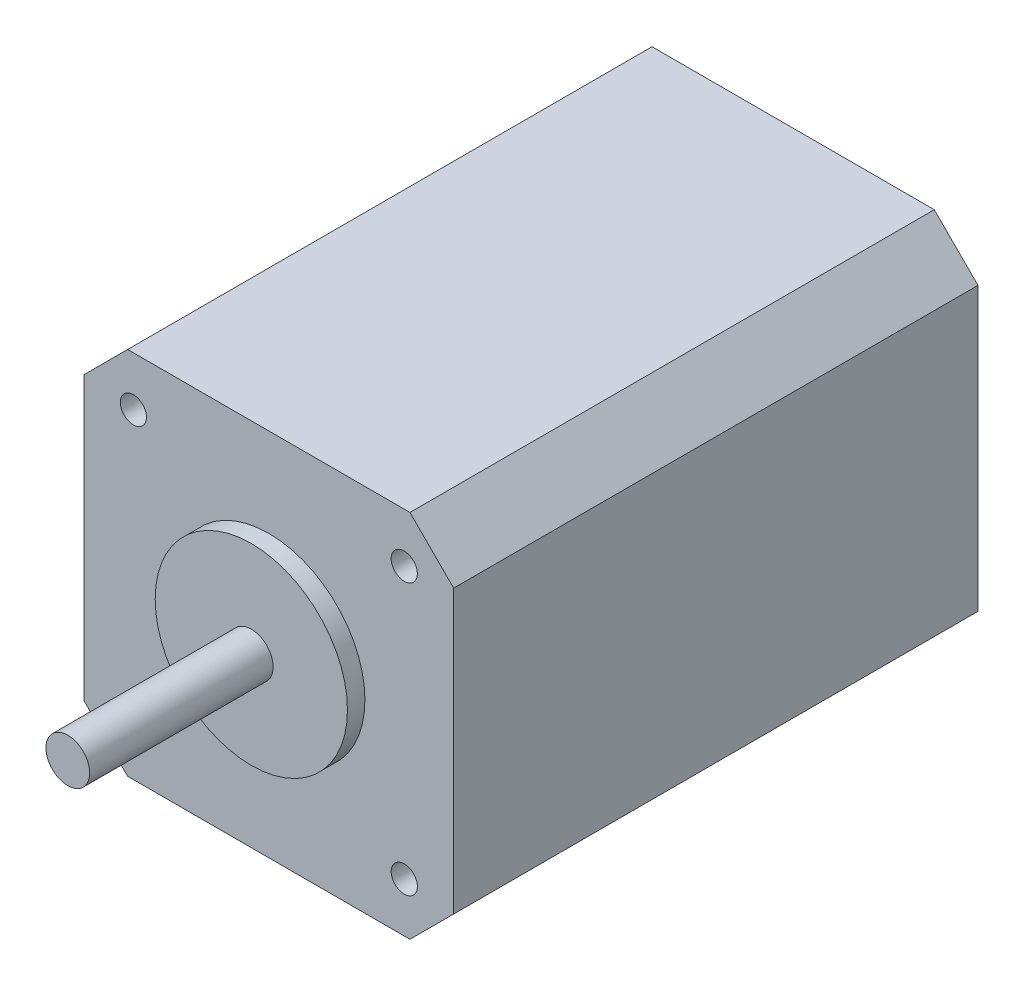
ISO-10303-21;
HEADER;
FILE_DESCRIPTION(('STEP AP214'),'2;1');
FILE_NAME('part.step','',(''),(''),'','','');
FILE_SCHEMA(('AUTOMOTIVE_DESIGN { 1 0 10303 214 1 1 1 1 }'));
ENDSEC;
DATA;
#1=APPLICATION_CONTEXT('core data for automotive mechanical design processes');
#2=APPLICATION_PROTOCOL_DEFINITION('international standard','automotive_design',2000,#1);
#3=PRODUCT_CONTEXT('',#1,'mechanical');
#4=PRODUCT('Part','Part','',(#3));
#5=PRODUCT_RELATED_PRODUCT_CATEGORY('part','',(#4));
#6=PRODUCT_DEFINITION_FORMATION('','',#4);
#7=PRODUCT_DEFINITION_CONTEXT('part definition',#1,'design');
#8=PRODUCT_DEFINITION('design','',#6,#7);
#9=PRODUCT_DEFINITION_SHAPE('','',#8);
#10=(LENGTH_UNIT() NAMED_UNIT(*) SI_UNIT(.MILLI.,.METRE.));
#11=(NAMED_UNIT(*) PLANE_ANGLE_UNIT() SI_UNIT($,.RADIAN.));
#12=(NAMED_UNIT(*) SI_UNIT($,.STERADIAN.) SOLID_ANGLE_UNIT());
#13=UNCERTAINTY_MEASURE_WITH_UNIT(LENGTH_MEASURE(1.E-05),#10,'distance_accuracy_value','');
#14=(GEOMETRIC_REPRESENTATION_CONTEXT(3) GLOBAL_UNCERTAINTY_ASSIGNED_CONTEXT((#13)) GLOBAL_UNIT_ASSIGNED_CONTEXT((#10,
#11,#12)) REPRESENTATION_CONTEXT('',''));
#15=CARTESIAN_POINT('',(0.,0.,0.));
#16=DIRECTION('',(0.,0.,1.));
#17=DIRECTION('',(1.,0.,0.));
#18=AXIS2_PLACEMENT_3D('',#15,#16,#17);
#19=CARTESIAN_POINT('',(0.,0.,30.));
#20=DIRECTION('',(0.,0.,-1.));
#21=DIRECTION('',(-1.,0.,0.));
#22=AXIS2_PLACEMENT_3D('',#19,#20,#21);
#23=PLANE('',#22);
#24=CARTESIAN_POINT('',(0.,0.,30.));
#25=DIRECTION('',(0.,0.,1.));
#26=DIRECTION('',(1.,0.,0.));
#27=AXIS2_PLACEMENT_3D('',#24,#25,#26);
#28=CIRCLE('',#27,11.);
#29=CARTESIAN_POINT('',(11.,0.,30.));
#30=VERTEX_POINT('',#29);
#31=EDGE_CURVE('E157',#30,#30,#28,.T.);
#32=ORIENTED_EDGE('',*,*,#31,.F.);
#33=EDGE_LOOP('',(#32));
#34=FACE_BOUND('',#33,.T.);
#35=DIRECTION('',(0.,-1.,0.));
#36=VECTOR('',#35,1.);
#37=CARTESIAN_POINT('',(-21.15,21.15,30.));
#38=LINE('',#37,#36);
#39=CARTESIAN_POINT('',(-21.15,16.15,30.));
#40=VERTEX_POINT('',#39);
#41=CARTESIAN_POINT('',(-21.15,-16.15,30.));
#42=VERTEX_POINT('',#41);
#43=EDGE_CURVE('E149',#40,#42,#38,.T.);
#44=ORIENTED_EDGE('',*,*,#43,.T.);
#45=DIRECTION('',(-0.707106781186546,0.707106781186549,0.));
#46=VECTOR('',#45,1.);
#47=CARTESIAN_POINT('',(-16.15,-21.15,30.));
#48=LINE('',#47,#46);
#49=CARTESIAN_POINT('',(-16.15,-21.15,30.));
#50=VERTEX_POINT('',#49);
#51=EDGE_CURVE('E179',#42,#50,#48,.F.);
#52=ORIENTED_EDGE('',*,*,#51,.T.);
#53=DIRECTION('',(1.,0.,0.));
#54=VECTOR('',#53,1.);
#55=CARTESIAN_POINT('',(21.15,-21.15,30.));
#56=LINE('',#55,#54);
#57=CARTESIAN_POINT('',(16.15,-21.15,30.));
#58=VERTEX_POINT('',#57);
#59=EDGE_CURVE('E126',#50,#58,#56,.T.);
#60=ORIENTED_EDGE('',*,*,#59,.T.);
#61=DIRECTION('',(-0.707106781186549,-0.707106781186547,0.));
#62=VECTOR('',#61,1.);
#63=CARTESIAN_POINT('',(21.15,-16.15,30.));
#64=LINE('',#63,#62);
#65=CARTESIAN_POINT('',(21.15,-16.15,30.));
#66=VERTEX_POINT('',#65);
#67=EDGE_CURVE('E176',#58,#66,#64,.F.);
#68=ORIENTED_EDGE('',*,*,#67,.T.);
#69=DIRECTION('',(0.,1.,0.));
#70=VECTOR('',#69,1.);
#71=CARTESIAN_POINT('',(21.15,21.15,30.));
#72=LINE('',#71,#70);
#73=CARTESIAN_POINT('',(21.15,16.15,30.));
#74=VERTEX_POINT('',#73);
#75=EDGE_CURVE('E206',#66,#74,#72,.T.);
#76=ORIENTED_EDGE('',*,*,#75,.T.);
#77=DIRECTION('',(0.707106781186547,-0.707106781186549,0.));
#78=VECTOR('',#77,1.);
#79=CARTESIAN_POINT('',(16.15,21.15,30.));
#80=LINE('',#79,#78);
#81=CARTESIAN_POINT('',(16.15,21.15,30.));
#82=VERTEX_POINT('',#81);
#83=EDGE_CURVE('E60',#74,#82,#80,.F.);
#84=ORIENTED_EDGE('',*,*,#83,.T.);
#85=DIRECTION('',(-1.,0.,0.));
#86=VECTOR('',#85,1.);
#87=CARTESIAN_POINT('',(21.15,21.15,30.));
#88=LINE('',#87,#86);
#89=CARTESIAN_POINT('',(-16.15,21.15,30.));
#90=VERTEX_POINT('',#89);
#91=EDGE_CURVE('E193',#82,#90,#88,.T.);
#92=ORIENTED_EDGE('',*,*,#91,.T.);
#93=DIRECTION('',(0.707106781186549,0.707106781186546,0.));
#94=VECTOR('',#93,1.);
#95=CARTESIAN_POINT('',(-21.15,16.15,30.));
#96=LINE('',#95,#94);
#97=EDGE_CURVE('E173',#90,#40,#96,.F.);
#98=ORIENTED_EDGE('',*,*,#97,.T.);
#99=EDGE_LOOP('',(#44,#52,#60,#68,#76,#84,#92,#98));
#100=FACE_BOUND('',#99,.T.);
#101=CARTESIAN_POINT('',(-15.5,15.5,30.));
#102=DIRECTION('',(0.,0.,1.));
#103=DIRECTION('',(1.,0.,0.));
#104=AXIS2_PLACEMENT_3D('',#101,#102,#103);
#105=CIRCLE('',#104,1.5);
#106=CARTESIAN_POINT('',(-14.,15.5,30.));
#107=VERTEX_POINT('',#106);
#108=EDGE_CURVE('E143',#107,#107,#105,.T.);
#109=ORIENTED_EDGE('',*,*,#108,.F.);
#110=EDGE_LOOP('',(#109));
#111=FACE_BOUND('',#110,.T.);
#112=CARTESIAN_POINT('',(-15.5,-15.5,30.));
#113=DIRECTION('',(0.,0.,1.));
#114=DIRECTION('',(1.,0.,0.));
#115=AXIS2_PLACEMENT_3D('',#112,#113,#114);
#116=CIRCLE('',#115,1.5);
#117=CARTESIAN_POINT('',(-14.,-15.5,30.));
#118=VERTEX_POINT('',#117);
#119=EDGE_CURVE('E239',#118,#118,#116,.T.);
#120=ORIENTED_EDGE('',*,*,#119,.F.);
#121=EDGE_LOOP('',(#120));
#122=FACE_BOUND('',#121,.T.);
#123=CARTESIAN_POINT('',(15.5,-15.5,30.));
#124=DIRECTION('',(0.,0.,1.));
#125=DIRECTION('',(-1.,0.,0.));
#126=AXIS2_PLACEMENT_3D('',#123,#124,#125);
#127=CIRCLE('',#126,1.5);
#128=CARTESIAN_POINT('',(14.,-15.5,30.));
#129=VERTEX_POINT('',#128);
#130=EDGE_CURVE('E231',#129,#129,#127,.T.);
#131=ORIENTED_EDGE('',*,*,#130,.F.);
#132=EDGE_LOOP('',(#131));
#133=FACE_BOUND('',#132,.T.);
#134=CARTESIAN_POINT('',(15.5,15.5,30.));
#135=DIRECTION('',(0.,0.,1.));
#136=DIRECTION('',(-1.,0.,0.));
#137=AXIS2_PLACEMENT_3D('',#134,#135,#136);
#138=CIRCLE('',#137,1.5);
#139=CARTESIAN_POINT('',(14.,15.5,30.));
#140=VERTEX_POINT('',#139);
#141=EDGE_CURVE('E222',#140,#140,#138,.T.);
#142=ORIENTED_EDGE('',*,*,#141,.F.);
#143=EDGE_LOOP('',(#142));
#144=FACE_BOUND('',#143,.T.);
#145=ADVANCED_FACE('F39',(#34,#100,#111,#122,#133,#144),#23,.F.);
#146=CARTESIAN_POINT('',(0.,0.,-30.));
#147=DIRECTION('',(0.,0.,-1.));
#148=DIRECTION('',(-1.,0.,0.));
#149=AXIS2_PLACEMENT_3D('',#146,#147,#148);
#150=PLANE('',#149);
#151=CARTESIAN_POINT('',(15.5,-15.5,-30.));
#152=DIRECTION('',(0.,0.,1.));
#153=DIRECTION('',(-1.,0.,0.));
#154=AXIS2_PLACEMENT_3D('',#151,#152,#153);
#155=CIRCLE('',#154,1.5);
#156=CARTESIAN_POINT('',(14.,-15.5,-30.));
#157=VERTEX_POINT('',#156);
#158=EDGE_CURVE('E226',#157,#157,#155,.T.);
#159=ORIENTED_EDGE('',*,*,#158,.T.);
#160=EDGE_LOOP('',(#159));
#161=FACE_BOUND('',#160,.T.);
#162=CARTESIAN_POINT('',(-15.5,15.5,-30.));
#163=DIRECTION('',(0.,0.,1.));
#164=DIRECTION('',(1.,0.,0.));
#165=AXIS2_PLACEMENT_3D('',#162,#163,#164);
#166=CIRCLE('',#165,1.5);
#167=CARTESIAN_POINT('',(-14.,15.5,-30.));
#168=VERTEX_POINT('',#167);
#169=EDGE_CURVE('E209',#168,#168,#166,.T.);
#170=ORIENTED_EDGE('',*,*,#169,.T.);
#171=EDGE_LOOP('',(#170));
#172=FACE_BOUND('',#171,.T.);
#173=DIRECTION('',(1.,0.,0.));
#174=VECTOR('',#173,1.);
#175=CARTESIAN_POINT('',(21.15,-21.15,-30.));
#176=LINE('',#175,#174);
#177=CARTESIAN_POINT('',(-16.15,-21.15,-30.));
#178=VERTEX_POINT('',#177);
#179=CARTESIAN_POINT('',(16.15,-21.15,-30.));
#180=VERTEX_POINT('',#179);
#181=EDGE_CURVE('E123',#178,#180,#176,.T.);
#182=ORIENTED_EDGE('',*,*,#181,.F.);
#183=DIRECTION('',(0.707106781186546,-0.707106781186549,0.));
#184=VECTOR('',#183,1.);
#185=CARTESIAN_POINT('',(-18.65,-18.65,-30.));
#186=LINE('',#185,#184);
#187=CARTESIAN_POINT('',(-21.15,-16.15,-30.));
#188=VERTEX_POINT('',#187);
#189=EDGE_CURVE('E105',#178,#188,#186,.F.);
#190=ORIENTED_EDGE('',*,*,#189,.T.);
#191=DIRECTION('',(0.,-1.,0.));
#192=VECTOR('',#191,1.);
#193=CARTESIAN_POINT('',(-21.15,21.15,-30.));
#194=LINE('',#193,#192);
#195=CARTESIAN_POINT('',(-21.15,16.15,-30.));
#196=VERTEX_POINT('',#195);
#197=EDGE_CURVE('E136',#196,#188,#194,.T.);
#198=ORIENTED_EDGE('',*,*,#197,.F.);
#199=DIRECTION('',(-0.707106781186549,-0.707106781186546,0.));
#200=VECTOR('',#199,1.);
#201=CARTESIAN_POINT('',(-18.6499999999999,18.65,-30.));
#202=LINE('',#201,#200);
#203=CARTESIAN_POINT('',(-16.15,21.15,-30.));
#204=VERTEX_POINT('',#203);
#205=EDGE_CURVE('E161',#196,#204,#202,.F.);
#206=ORIENTED_EDGE('',*,*,#205,.T.);
#207=DIRECTION('',(-1.,0.,0.));
#208=VECTOR('',#207,1.);
#209=CARTESIAN_POINT('',(21.15,21.15,-30.));
#210=LINE('',#209,#208);
#211=CARTESIAN_POINT('',(16.15,21.15,-30.));
#212=VERTEX_POINT('',#211);
#213=EDGE_CURVE('E141',#212,#204,#210,.T.);
#214=ORIENTED_EDGE('',*,*,#213,.F.);
#215=DIRECTION('',(-0.707106781186547,0.707106781186549,0.));
#216=VECTOR('',#215,1.);
#217=CARTESIAN_POINT('',(18.65,18.65,-30.));
#218=LINE('',#217,#216);
#219=CARTESIAN_POINT('',(21.15,16.15,-30.));
#220=VERTEX_POINT('',#219);
#221=EDGE_CURVE('E128',#212,#220,#218,.F.);
#222=ORIENTED_EDGE('',*,*,#221,.T.);
#223=DIRECTION('',(0.,1.,0.));
#224=VECTOR('',#223,1.);
#225=CARTESIAN_POINT('',(21.15,21.15,-30.));
#226=LINE('',#225,#224);
#227=CARTESIAN_POINT('',(21.15,-16.15,-30.));
#228=VERTEX_POINT('',#227);
#229=EDGE_CURVE('E135',#228,#220,#226,.T.);
#230=ORIENTED_EDGE('',*,*,#229,.F.);
#231=DIRECTION('',(0.707106781186549,0.707106781186547,0.));
#232=VECTOR('',#231,1.);
#233=CARTESIAN_POINT('',(18.65,-18.65,-30.));
#234=LINE('',#233,#232);
#235=EDGE_CURVE('E117',#228,#180,#234,.F.);
#236=ORIENTED_EDGE('',*,*,#235,.T.);
#237=EDGE_LOOP('',(#182,#190,#198,#206,#214,#222,#230,#236));
#238=FACE_BOUND('',#237,.T.);
#239=CARTESIAN_POINT('',(-15.5,-15.5,-30.));
#240=DIRECTION('',(0.,0.,1.));
#241=DIRECTION('',(1.,0.,0.));
#242=AXIS2_PLACEMENT_3D('',#239,#240,#241);
#243=CIRCLE('',#242,1.5);
#244=CARTESIAN_POINT('',(-14.,-15.5,-30.));
#245=VERTEX_POINT('',#244);
#246=EDGE_CURVE('E235',#245,#245,#243,.T.);
#247=ORIENTED_EDGE('',*,*,#246,.T.);
#248=EDGE_LOOP('',(#247));
#249=FACE_BOUND('',#248,.T.);
#250=CARTESIAN_POINT('',(15.5,15.5,-30.));
#251=DIRECTION('',(0.,0.,1.));
#252=DIRECTION('',(-1.,0.,0.));
#253=AXIS2_PLACEMENT_3D('',#250,#251,#252);
#254=CIRCLE('',#253,1.5);
#255=CARTESIAN_POINT('',(14.,15.5,-30.));
#256=VERTEX_POINT('',#255);
#257=EDGE_CURVE('E227',#256,#256,#254,.T.);
#258=ORIENTED_EDGE('',*,*,#257,.T.);
#259=EDGE_LOOP('',(#258));
#260=FACE_BOUND('',#259,.T.);
#261=ADVANCED_FACE('F131',(#161,#172,#238,#249,#260),#150,.T.);
#262=CARTESIAN_POINT('',(-21.15,21.15,30.));
#263=DIRECTION('',(1.,0.,0.));
#264=DIRECTION('',(0.,0.,-1.));
#265=AXIS2_PLACEMENT_3D('',#262,#263,#264);
#266=PLANE('',#265);
#267=ORIENTED_EDGE('',*,*,#197,.T.);
#268=DIRECTION('',(0.,0.,1.));
#269=VECTOR('',#268,1.);
#270=CARTESIAN_POINT('',(-21.15,-16.15,30.));
#271=LINE('',#270,#269);
#272=EDGE_CURVE('E110',#188,#42,#271,.T.);
#273=ORIENTED_EDGE('',*,*,#272,.T.);
#274=ORIENTED_EDGE('',*,*,#43,.F.);
#275=DIRECTION('',(0.,0.,-1.));
#276=VECTOR('',#275,1.);
#277=CARTESIAN_POINT('',(-21.15,16.15,30.));
#278=LINE('',#277,#276);
#279=EDGE_CURVE('E116',#40,#196,#278,.T.);
#280=ORIENTED_EDGE('',*,*,#279,.T.);
#281=EDGE_LOOP('',(#267,#273,#274,#280));
#282=FACE_BOUND('',#281,.T.);
#283=ADVANCED_FACE('F201',(#282),#266,.F.);
#284=CARTESIAN_POINT('',(21.15,-21.15,30.));
#285=DIRECTION('',(0.,1.,0.));
#286=DIRECTION('',(-1.,0.,0.));
#287=AXIS2_PLACEMENT_3D('',#284,#285,#286);
#288=PLANE('',#287);
#289=ORIENTED_EDGE('',*,*,#59,.F.);
#290=DIRECTION('',(0.,0.,-1.));
#291=VECTOR('',#290,1.);
#292=CARTESIAN_POINT('',(-16.15,-21.15,30.));
#293=LINE('',#292,#291);
#294=EDGE_CURVE('E109',#50,#178,#293,.T.);
#295=ORIENTED_EDGE('',*,*,#294,.T.);
#296=ORIENTED_EDGE('',*,*,#181,.T.);
#297=DIRECTION('',(0.,0.,1.));
#298=VECTOR('',#297,1.);
#299=CARTESIAN_POINT('',(16.15,-21.15,30.));
#300=LINE('',#299,#298);
#301=EDGE_CURVE('E129',#180,#58,#300,.T.);
#302=ORIENTED_EDGE('',*,*,#301,.T.);
#303=EDGE_LOOP('',(#289,#295,#296,#302));
#304=FACE_BOUND('',#303,.T.);
#305=ADVANCED_FACE('F122',(#304),#288,.F.);
#306=CARTESIAN_POINT('',(21.15,21.15,30.));
#307=DIRECTION('',(-1.,0.,0.));
#308=DIRECTION('',(0.,-1.,0.));
#309=AXIS2_PLACEMENT_3D('',#306,#307,#308);
#310=PLANE('',#309);
#311=ORIENTED_EDGE('',*,*,#75,.F.);
#312=DIRECTION('',(0.,0.,-1.));
#313=VECTOR('',#312,1.);
#314=CARTESIAN_POINT('',(21.15,-16.15,30.));
#315=LINE('',#314,#313);
#316=EDGE_CURVE('E185',#66,#228,#315,.T.);
#317=ORIENTED_EDGE('',*,*,#316,.T.);
#318=ORIENTED_EDGE('',*,*,#229,.T.);
#319=DIRECTION('',(0.,0.,1.));
#320=VECTOR('',#319,1.);
#321=CARTESIAN_POINT('',(21.15,16.15,30.));
#322=LINE('',#321,#320);
#323=EDGE_CURVE('E182',#220,#74,#322,.T.);
#324=ORIENTED_EDGE('',*,*,#323,.T.);
#325=EDGE_LOOP('',(#311,#317,#318,#324));
#326=FACE_BOUND('',#325,.T.);
#327=ADVANCED_FACE('F265',(#326),#310,.F.);
#328=CARTESIAN_POINT('',(21.15,21.15,30.));
#329=DIRECTION('',(0.,-1.,0.));
#330=DIRECTION('',(1.,0.,0.));
#331=AXIS2_PLACEMENT_3D('',#328,#329,#330);
#332=PLANE('',#331);
#333=ORIENTED_EDGE('',*,*,#213,.T.);
#334=DIRECTION('',(0.,0.,1.));
#335=VECTOR('',#334,1.);
#336=CARTESIAN_POINT('',(-16.15,21.15,30.));
#337=LINE('',#336,#335);
#338=EDGE_CURVE('E11',#204,#90,#337,.T.);
#339=ORIENTED_EDGE('',*,*,#338,.T.);
#340=ORIENTED_EDGE('',*,*,#91,.F.);
#341=DIRECTION('',(0.,0.,-1.));
#342=VECTOR('',#341,1.);
#343=CARTESIAN_POINT('',(16.15,21.15,30.));
#344=LINE('',#343,#342);
#345=EDGE_CURVE('E48',#82,#212,#344,.T.);
#346=ORIENTED_EDGE('',*,*,#345,.T.);
#347=EDGE_LOOP('',(#333,#339,#340,#346));
#348=FACE_BOUND('',#347,.T.);
#349=ADVANCED_FACE('F192',(#348),#332,.F.);
#350=CARTESIAN_POINT('',(-15.5,15.5,30.));
#351=DIRECTION('',(0.,0.,-1.));
#352=DIRECTION('',(-1.,0.,0.));
#353=AXIS2_PLACEMENT_3D('',#350,#351,#352);
#354=CYLINDRICAL_SURFACE('',#353,1.5);
#355=ORIENTED_EDGE('',*,*,#108,.T.);
#356=EDGE_LOOP('',(#355));
#357=FACE_BOUND('',#356,.T.);
#358=ORIENTED_EDGE('',*,*,#169,.F.);
#359=EDGE_LOOP('',(#358));
#360=FACE_BOUND('',#359,.T.);
#361=ADVANCED_FACE('F254',(#357,#360),#354,.F.);
#362=CARTESIAN_POINT('',(-15.5,-15.5,30.));
#363=DIRECTION('',(0.,0.,-1.));
#364=DIRECTION('',(-1.,0.,0.));
#365=AXIS2_PLACEMENT_3D('',#362,#363,#364);
#366=CYLINDRICAL_SURFACE('',#365,1.5);
#367=ORIENTED_EDGE('',*,*,#119,.T.);
#368=EDGE_LOOP('',(#367));
#369=FACE_BOUND('',#368,.T.);
#370=ORIENTED_EDGE('',*,*,#246,.F.);
#371=EDGE_LOOP('',(#370));
#372=FACE_BOUND('',#371,.T.);
#373=ADVANCED_FACE('F256',(#369,#372),#366,.F.);
#374=CARTESIAN_POINT('',(15.5,-15.5,30.));
#375=DIRECTION('',(0.,0.,-1.));
#376=DIRECTION('',(-1.,0.,0.));
#377=AXIS2_PLACEMENT_3D('',#374,#375,#376);
#378=CYLINDRICAL_SURFACE('',#377,1.5);
#379=ORIENTED_EDGE('',*,*,#130,.T.);
#380=EDGE_LOOP('',(#379));
#381=FACE_BOUND('',#380,.T.);
#382=ORIENTED_EDGE('',*,*,#158,.F.);
#383=EDGE_LOOP('',(#382));
#384=FACE_BOUND('',#383,.T.);
#385=ADVANCED_FACE('F262',(#381,#384),#378,.F.);
#386=CARTESIAN_POINT('',(15.5,15.5,30.));
#387=DIRECTION('',(0.,0.,-1.));
#388=DIRECTION('',(-1.,0.,0.));
#389=AXIS2_PLACEMENT_3D('',#386,#387,#388);
#390=CYLINDRICAL_SURFACE('',#389,1.5);
#391=ORIENTED_EDGE('',*,*,#141,.T.);
#392=EDGE_LOOP('',(#391));
#393=FACE_BOUND('',#392,.T.);
#394=ORIENTED_EDGE('',*,*,#257,.F.);
#395=EDGE_LOOP('',(#394));
#396=FACE_BOUND('',#395,.T.);
#397=ADVANCED_FACE('F307',(#393,#396),#390,.F.);
#398=CARTESIAN_POINT('',(0.,0.,32.));
#399=DIRECTION('',(0.,0.,-1.));
#400=DIRECTION('',(-1.,0.,0.));
#401=AXIS2_PLACEMENT_3D('',#398,#399,#400);
#402=CYLINDRICAL_SURFACE('',#401,11.);
#403=CARTESIAN_POINT('',(0.,0.,32.));
#404=DIRECTION('',(0.,0.,1.));
#405=DIRECTION('',(1.,0.,0.));
#406=AXIS2_PLACEMENT_3D('',#403,#404,#405);
#407=CIRCLE('',#406,11.);
#408=CARTESIAN_POINT('',(11.,0.,32.));
#409=VERTEX_POINT('',#408);
#410=EDGE_CURVE('E154',#409,#409,#407,.T.);
#411=ORIENTED_EDGE('',*,*,#410,.F.);
#412=EDGE_LOOP('',(#411));
#413=FACE_BOUND('',#412,.T.);
#414=ORIENTED_EDGE('',*,*,#31,.T.);
#415=EDGE_LOOP('',(#414));
#416=FACE_BOUND('',#415,.T.);
#417=ADVANCED_FACE('F310',(#413,#416),#402,.T.);
#418=CARTESIAN_POINT('',(0.,0.,32.));
#419=DIRECTION('',(0.,0.,1.));
#420=DIRECTION('',(1.,0.,0.));
#421=AXIS2_PLACEMENT_3D('',#418,#419,#420);
#422=PLANE('',#421);
#423=CARTESIAN_POINT('',(0.,0.,32.));
#424=DIRECTION('',(0.,0.,1.));
#425=DIRECTION('',(1.,0.,0.));
#426=AXIS2_PLACEMENT_3D('',#423,#424,#425);
#427=CIRCLE('',#426,2.5);
#428=CARTESIAN_POINT('',(2.5,0.,32.));
#429=VERTEX_POINT('',#428);
#430=EDGE_CURVE('E150',#429,#429,#427,.F.);
#431=ORIENTED_EDGE('',*,*,#430,.T.);
#432=EDGE_LOOP('',(#431));
#433=FACE_BOUND('',#432,.T.);
#434=ORIENTED_EDGE('',*,*,#410,.T.);
#435=EDGE_LOOP('',(#434));
#436=FACE_BOUND('',#435,.T.);
#437=ADVANCED_FACE('F318',(#433,#436),#422,.T.);
#438=CARTESIAN_POINT('',(0.,0.,53.));
#439=DIRECTION('',(0.,0.,-1.));
#440=DIRECTION('',(-1.,0.,0.));
#441=AXIS2_PLACEMENT_3D('',#438,#439,#440);
#442=CYLINDRICAL_SURFACE('',#441,2.5);
#443=ORIENTED_EDGE('',*,*,#430,.F.);
#444=EDGE_LOOP('',(#443));
#445=FACE_BOUND('',#444,.T.);
#446=CARTESIAN_POINT('',(0.,0.,53.));
#447=DIRECTION('',(0.,0.,1.));
#448=DIRECTION('',(1.,0.,0.));
#449=AXIS2_PLACEMENT_3D('',#446,#447,#448);
#450=CIRCLE('',#449,2.5);
#451=CARTESIAN_POINT('',(2.5,0.,53.));
#452=VERTEX_POINT('',#451);
#453=EDGE_CURVE('E155',#452,#452,#450,.T.);
#454=ORIENTED_EDGE('',*,*,#453,.F.);
#455=EDGE_LOOP('',(#454));
#456=FACE_BOUND('',#455,.T.);
#457=ADVANCED_FACE('F326',(#445,#456),#442,.T.);
#458=CARTESIAN_POINT('',(0.,0.,53.));
#459=DIRECTION('',(0.,0.,1.));
#460=DIRECTION('',(1.,0.,0.));
#461=AXIS2_PLACEMENT_3D('',#458,#459,#460);
#462=PLANE('',#461);
#463=ORIENTED_EDGE('',*,*,#453,.T.);
#464=EDGE_LOOP('',(#463));
#465=FACE_BOUND('',#464,.T.);
#466=ADVANCED_FACE('F286',(#465),#462,.T.);
#467=CARTESIAN_POINT('',(-16.15,-21.15,30.));
#468=DIRECTION('',(0.707106781186549,0.707106781186546,0.));
#469=DIRECTION('',(0.,0.,-1.));
#470=AXIS2_PLACEMENT_3D('',#467,#468,#469);
#471=PLANE('',#470);
#472=ORIENTED_EDGE('',*,*,#51,.F.);
#473=ORIENTED_EDGE('',*,*,#272,.F.);
#474=ORIENTED_EDGE('',*,*,#189,.F.);
#475=ORIENTED_EDGE('',*,*,#294,.F.);
#476=EDGE_LOOP('',(#472,#473,#474,#475));
#477=FACE_BOUND('',#476,.T.);
#478=ADVANCED_FACE('F108',(#477),#471,.F.);
#479=CARTESIAN_POINT('',(21.15,-16.15,30.));
#480=DIRECTION('',(-0.707106781186546,0.707106781186548,0.));
#481=DIRECTION('',(0.,0.,-1.));
#482=AXIS2_PLACEMENT_3D('',#479,#480,#481);
#483=PLANE('',#482);
#484=ORIENTED_EDGE('',*,*,#67,.F.);
#485=ORIENTED_EDGE('',*,*,#301,.F.);
#486=ORIENTED_EDGE('',*,*,#235,.F.);
#487=ORIENTED_EDGE('',*,*,#316,.F.);
#488=EDGE_LOOP('',(#484,#485,#486,#487));
#489=FACE_BOUND('',#488,.T.);
#490=ADVANCED_FACE('F285',(#489),#483,.F.);
#491=CARTESIAN_POINT('',(-21.15,16.15,30.));
#492=DIRECTION('',(0.707106781186545,-0.707106781186549,0.));
#493=DIRECTION('',(0.,0.,-1.));
#494=AXIS2_PLACEMENT_3D('',#491,#492,#493);
#495=PLANE('',#494);
#496=ORIENTED_EDGE('',*,*,#97,.F.);
#497=ORIENTED_EDGE('',*,*,#338,.F.);
#498=ORIENTED_EDGE('',*,*,#205,.F.);
#499=ORIENTED_EDGE('',*,*,#279,.F.);
#500=EDGE_LOOP('',(#496,#497,#498,#499));
#501=FACE_BOUND('',#500,.T.);
#502=ADVANCED_FACE('F198',(#501),#495,.F.);
#503=CARTESIAN_POINT('',(16.15,21.15,30.));
#504=DIRECTION('',(-0.707106781186548,-0.707106781186546,0.));
#505=DIRECTION('',(0.,0.,-1.));
#506=AXIS2_PLACEMENT_3D('',#503,#504,#505);
#507=PLANE('',#506);
#508=ORIENTED_EDGE('',*,*,#83,.F.);
#509=ORIENTED_EDGE('',*,*,#323,.F.);
#510=ORIENTED_EDGE('',*,*,#221,.F.);
#511=ORIENTED_EDGE('',*,*,#345,.F.);
#512=EDGE_LOOP('',(#508,#509,#510,#511));
#513=FACE_BOUND('',#512,.T.);
#514=ADVANCED_FACE('F41',(#513),#507,.F.);
#515=CLOSED_SHELL('',(#145,#261,#283,#305,#327,#349,#361,#373,#385,#397,#417,#437,#457,#466,
#478,#490,#502,#514));
#516=MANIFOLD_SOLID_BREP('B2',#515);
#517=ADVANCED_BREP_SHAPE_REPRESENTATION('',(#18,#516),#14);
#518=SHAPE_DEFINITION_REPRESENTATION(#9,#517);
ENDSEC;
END-ISO-10303-21;
